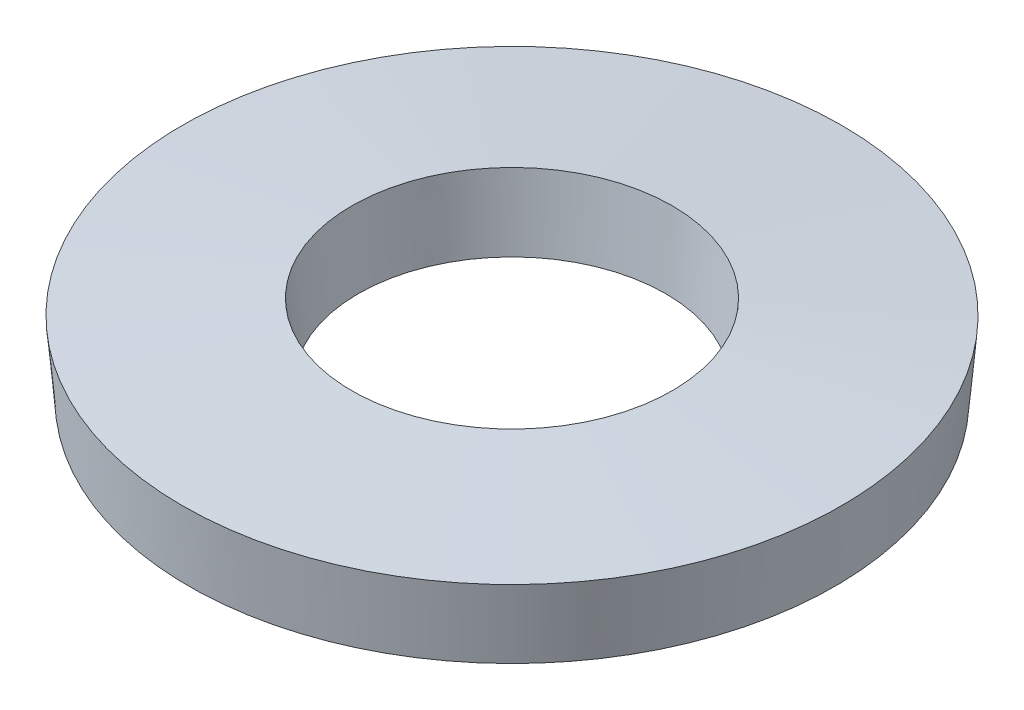
ISO-10303-21;
HEADER;
FILE_DESCRIPTION(('STEP AP214'),'2;1');
FILE_NAME('part.step','',(''),(''),'','','');
FILE_SCHEMA(('AUTOMOTIVE_DESIGN { 1 0 10303 214 1 1 1 1 }'));
ENDSEC;
DATA;
#1=APPLICATION_CONTEXT('core data for automotive mechanical design processes');
#2=APPLICATION_PROTOCOL_DEFINITION('international standard','automotive_design',2000,#1);
#3=PRODUCT_CONTEXT('',#1,'mechanical');
#4=PRODUCT('Part','Part','',(#3));
#5=PRODUCT_RELATED_PRODUCT_CATEGORY('part','',(#4));
#6=PRODUCT_DEFINITION_FORMATION('','',#4);
#7=PRODUCT_DEFINITION_CONTEXT('part definition',#1,'design');
#8=PRODUCT_DEFINITION('design','',#6,#7);
#9=PRODUCT_DEFINITION_SHAPE('','',#8);
#10=(LENGTH_UNIT() NAMED_UNIT(*) SI_UNIT(.MILLI.,.METRE.));
#11=(NAMED_UNIT(*) PLANE_ANGLE_UNIT() SI_UNIT($,.RADIAN.));
#12=(NAMED_UNIT(*) SI_UNIT($,.STERADIAN.) SOLID_ANGLE_UNIT());
#13=UNCERTAINTY_MEASURE_WITH_UNIT(LENGTH_MEASURE(1.E-05),#10,'distance_accuracy_value','');
#14=(GEOMETRIC_REPRESENTATION_CONTEXT(3) GLOBAL_UNCERTAINTY_ASSIGNED_CONTEXT((#13)) GLOBAL_UNIT_ASSIGNED_CONTEXT((#10,
#11,#12)) REPRESENTATION_CONTEXT('',''));
#15=CARTESIAN_POINT('',(0.,0.,0.));
#16=DIRECTION('',(0.,0.,1.));
#17=DIRECTION('',(1.,0.,0.));
#18=AXIS2_PLACEMENT_3D('',#15,#16,#17);
#19=CARTESIAN_POINT('',(0.,0.,0.));
#20=DIRECTION('',(0.,1.,0.));
#21=DIRECTION('',(0.,0.,1.));
#22=AXIS2_PLACEMENT_3D('',#19,#20,#21);
#23=CONICAL_SURFACE('',#22,8.82434112161976,0.0879427525119533);
#24=CARTESIAN_POINT('',(0.,1.99227105546565,0.));
#25=DIRECTION('',(0.,-1.,0.));
#26=DIRECTION('',(0.,0.,-1.));
#27=AXIS2_PLACEMENT_3D('',#24,#25,#26);
#28=CIRCLE('',#27,9.);
#29=CARTESIAN_POINT('',(0.,1.99227105546565,-9.));
#30=VERTEX_POINT('',#29);
#31=EDGE_CURVE('E49',#30,#30,#28,.T.);
#32=ORIENTED_EDGE('',*,*,#31,.T.);
#33=EDGE_LOOP('',(#32));
#34=FACE_BOUND('',#33,.T.);
#35=CARTESIAN_POINT('',(0.,0.,0.));
#36=DIRECTION('',(0.,-1.,0.));
#37=DIRECTION('',(0.,0.,-1.));
#38=AXIS2_PLACEMENT_3D('',#35,#36,#37);
#39=CIRCLE('',#38,8.82434112161976);
#40=CARTESIAN_POINT('',(0.,0.,-8.82434112161976));
#41=VERTEX_POINT('',#40);
#42=EDGE_CURVE('E10',#41,#41,#39,.T.);
#43=ORIENTED_EDGE('',*,*,#42,.F.);
#44=EDGE_LOOP('',(#43));
#45=FACE_BOUND('',#44,.T.);
#46=ADVANCED_FACE('F35',(#34,#45),#23,.T.);
#47=CARTESIAN_POINT('',(0.,0.407728944534353,0.));
#48=DIRECTION('',(0.,-1.,0.));
#49=DIRECTION('',(0.,0.,-1.));
#50=AXIS2_PLACEMENT_3D('',#47,#48,#49);
#51=CONICAL_SURFACE('',#50,4.2,1.48285357428294);
#52=ORIENTED_EDGE('',*,*,#42,.T.);
#53=EDGE_LOOP('',(#52));
#54=FACE_BOUND('',#53,.T.);
#55=CARTESIAN_POINT('',(0.,0.407728944534353,0.));
#56=DIRECTION('',(0.,-1.,0.));
#57=DIRECTION('',(0.,0.,-1.));
#58=AXIS2_PLACEMENT_3D('',#55,#56,#57);
#59=CIRCLE('',#58,4.2);
#60=CARTESIAN_POINT('',(0.,0.407728944534353,-4.2));
#61=VERTEX_POINT('',#60);
#62=EDGE_CURVE('E41',#61,#61,#59,.T.);
#63=ORIENTED_EDGE('',*,*,#62,.F.);
#64=EDGE_LOOP('',(#63));
#65=FACE_BOUND('',#64,.T.);
#66=ADVANCED_FACE('F65',(#54,#65),#51,.F.);
#67=CARTESIAN_POINT('',(0.,2.4,0.));
#68=DIRECTION('',(0.,1.,0.));
#69=DIRECTION('',(0.,0.,1.));
#70=AXIS2_PLACEMENT_3D('',#67,#68,#69);
#71=CONICAL_SURFACE('',#70,4.37565887838024,0.0879427525119533);
#72=ORIENTED_EDGE('',*,*,#62,.T.);
#73=EDGE_LOOP('',(#72));
#74=FACE_BOUND('',#73,.T.);
#75=CARTESIAN_POINT('',(0.,2.4,0.));
#76=DIRECTION('',(0.,-1.,0.));
#77=DIRECTION('',(0.,0.,-1.));
#78=AXIS2_PLACEMENT_3D('',#75,#76,#77);
#79=CIRCLE('',#78,4.37565887838024);
#80=CARTESIAN_POINT('',(0.,2.4,-4.37565887838024));
#81=VERTEX_POINT('',#80);
#82=EDGE_CURVE('E45',#81,#81,#79,.T.);
#83=ORIENTED_EDGE('',*,*,#82,.F.);
#84=EDGE_LOOP('',(#83));
#85=FACE_BOUND('',#84,.T.);
#86=ADVANCED_FACE('F59',(#74,#85),#71,.F.);
#87=CARTESIAN_POINT('',(0.,1.99227105546565,0.));
#88=DIRECTION('',(0.,-1.,0.));
#89=DIRECTION('',(0.,0.,-1.));
#90=AXIS2_PLACEMENT_3D('',#87,#88,#89);
#91=CONICAL_SURFACE('',#90,9.,1.48285357428294);
#92=ORIENTED_EDGE('',*,*,#82,.T.);
#93=EDGE_LOOP('',(#92));
#94=FACE_BOUND('',#93,.T.);
#95=ORIENTED_EDGE('',*,*,#31,.F.);
#96=EDGE_LOOP('',(#95));
#97=FACE_BOUND('',#96,.T.);
#98=ADVANCED_FACE('F57',(#94,#97),#91,.T.);
#99=CLOSED_SHELL('',(#46,#66,#86,#98));
#100=MANIFOLD_SOLID_BREP('B2',#99);
#101=ADVANCED_BREP_SHAPE_REPRESENTATION('',(#18,#100),#14);
#102=SHAPE_DEFINITION_REPRESENTATION(#9,#101);
ENDSEC;
END-ISO-10303-21;
